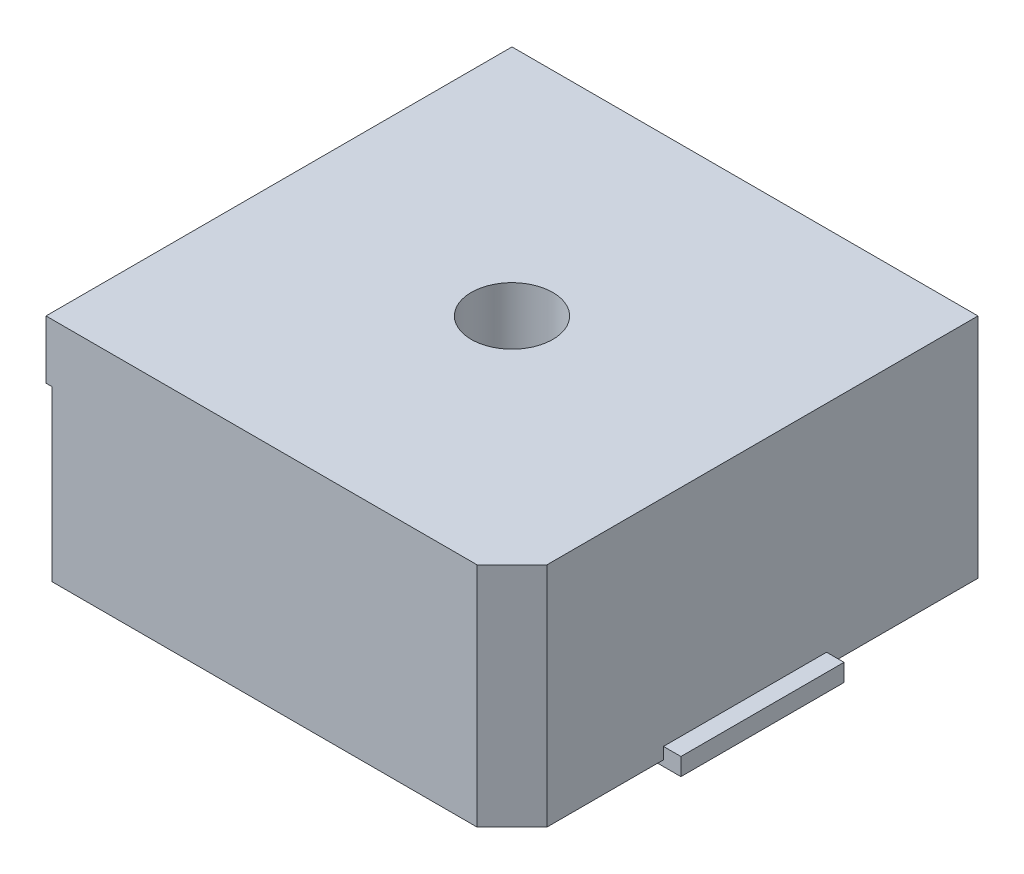
ISO-10303-21;
HEADER;
FILE_DESCRIPTION(('STEP AP214'),'2;1');
FILE_NAME('part.step','',(''),(''),'','','');
FILE_SCHEMA(('AUTOMOTIVE_DESIGN { 1 0 10303 214 1 1 1 1 }'));
ENDSEC;
DATA;
#1=APPLICATION_CONTEXT('core data for automotive mechanical design processes');
#2=APPLICATION_PROTOCOL_DEFINITION('international standard','automotive_design',2000,#1);
#3=PRODUCT_CONTEXT('',#1,'mechanical');
#4=PRODUCT('Part','Part','',(#3));
#5=PRODUCT_RELATED_PRODUCT_CATEGORY('part','',(#4));
#6=PRODUCT_DEFINITION_FORMATION('','',#4);
#7=PRODUCT_DEFINITION_CONTEXT('part definition',#1,'design');
#8=PRODUCT_DEFINITION('design','',#6,#7);
#9=PRODUCT_DEFINITION_SHAPE('','',#8);
#10=(LENGTH_UNIT() NAMED_UNIT(*) SI_UNIT(.MILLI.,.METRE.));
#11=(NAMED_UNIT(*) PLANE_ANGLE_UNIT() SI_UNIT($,.RADIAN.));
#12=(NAMED_UNIT(*) SI_UNIT($,.STERADIAN.) SOLID_ANGLE_UNIT());
#13=UNCERTAINTY_MEASURE_WITH_UNIT(LENGTH_MEASURE(1.E-05),#10,'distance_accuracy_value','');
#14=(GEOMETRIC_REPRESENTATION_CONTEXT(3) GLOBAL_UNCERTAINTY_ASSIGNED_CONTEXT((#13)) GLOBAL_UNIT_ASSIGNED_CONTEXT((#10,
#11,#12)) REPRESENTATION_CONTEXT('',''));
#15=CARTESIAN_POINT('',(0.,0.,0.));
#16=DIRECTION('',(0.,0.,1.));
#17=DIRECTION('',(1.,0.,0.));
#18=AXIS2_PLACEMENT_3D('',#15,#16,#17);
#19=CARTESIAN_POINT('',(-2.,2.,-2.));
#20=DIRECTION('',(1.,0.,0.));
#21=DIRECTION('',(0.,0.,-1.));
#22=AXIS2_PLACEMENT_3D('',#19,#20,#21);
#23=PLANE('',#22);
#24=DIRECTION('',(0.,-1.,0.));
#25=VECTOR('',#24,1.);
#26=CARTESIAN_POINT('',(-2.,2.,-2.));
#27=LINE('',#26,#25);
#28=CARTESIAN_POINT('',(-2.,2.,-2.));
#29=VERTEX_POINT('',#28);
#30=CARTESIAN_POINT('',(-2.,1.5,-2.));
#31=VERTEX_POINT('',#30);
#32=EDGE_CURVE('E439',#29,#31,#27,.T.);
#33=ORIENTED_EDGE('',*,*,#32,.T.);
#34=DIRECTION('',(0.,0.,-1.));
#35=VECTOR('',#34,1.);
#36=CARTESIAN_POINT('',(-2.,1.5,-2.));
#37=LINE('',#36,#35);
#38=CARTESIAN_POINT('',(-2.,1.5,-1.875));
#39=VERTEX_POINT('',#38);
#40=EDGE_CURVE('E485',#39,#31,#37,.T.);
#41=ORIENTED_EDGE('',*,*,#40,.F.);
#42=DIRECTION('',(0.,-1.,0.));
#43=VECTOR('',#42,1.);
#44=CARTESIAN_POINT('',(-2.,1.5,-1.875));
#45=LINE('',#44,#43);
#46=CARTESIAN_POINT('',(-2.,1.9,-1.875));
#47=VERTEX_POINT('',#46);
#48=EDGE_CURVE('E481',#47,#39,#45,.T.);
#49=ORIENTED_EDGE('',*,*,#48,.F.);
#50=DIRECTION('',(0.,0.,-1.));
#51=VECTOR('',#50,1.);
#52=CARTESIAN_POINT('',(-2.,1.9,1.875));
#53=LINE('',#52,#51);
#54=CARTESIAN_POINT('',(-2.,1.9,1.875));
#55=VERTEX_POINT('',#54);
#56=EDGE_CURVE('E472',#55,#47,#53,.T.);
#57=ORIENTED_EDGE('',*,*,#56,.F.);
#58=DIRECTION('',(0.,1.,0.));
#59=VECTOR('',#58,1.);
#60=CARTESIAN_POINT('',(-2.,1.9,1.875));
#61=LINE('',#60,#59);
#62=CARTESIAN_POINT('',(-2.,1.5,1.875));
#63=VERTEX_POINT('',#62);
#64=EDGE_CURVE('E464',#63,#55,#61,.T.);
#65=ORIENTED_EDGE('',*,*,#64,.F.);
#66=DIRECTION('',(0.,0.,-1.));
#67=VECTOR('',#66,1.);
#68=CARTESIAN_POINT('',(-2.,1.5,1.875));
#69=LINE('',#68,#67);
#70=CARTESIAN_POINT('',(-2.,1.5,2.));
#71=VERTEX_POINT('',#70);
#72=EDGE_CURVE('E461',#71,#63,#69,.T.);
#73=ORIENTED_EDGE('',*,*,#72,.F.);
#74=DIRECTION('',(0.,-1.,0.));
#75=VECTOR('',#74,1.);
#76=CARTESIAN_POINT('',(-2.,2.,2.));
#77=LINE('',#76,#75);
#78=CARTESIAN_POINT('',(-2.,2.,2.));
#79=VERTEX_POINT('',#78);
#80=EDGE_CURVE('E52',#79,#71,#77,.T.);
#81=ORIENTED_EDGE('',*,*,#80,.F.);
#82=DIRECTION('',(0.,0.,1.));
#83=VECTOR('',#82,1.);
#84=CARTESIAN_POINT('',(-2.,2.,-2.));
#85=LINE('',#84,#83);
#86=EDGE_CURVE('E425',#29,#79,#85,.T.);
#87=ORIENTED_EDGE('',*,*,#86,.F.);
#88=EDGE_LOOP('',(#33,#41,#49,#57,#65,#73,#81,#87));
#89=FACE_BOUND('',#88,.T.);
#90=ADVANCED_FACE('F42',(#89),#23,.F.);
#91=DIRECTION('',(0.,0.,-1.));
#92=VECTOR('',#91,1.);
#93=CARTESIAN_POINT('',(-2.,0.0499999999999997,2.));
#94=LINE('',#93,#92);
#95=CARTESIAN_POINT('',(-2.,0.0499999999999997,0.750000000000001));
#96=VERTEX_POINT('',#95);
#97=CARTESIAN_POINT('',(-2.,0.0499999999999997,0.7));
#98=VERTEX_POINT('',#97);
#99=EDGE_CURVE('E309',#96,#98,#94,.T.);
#100=ORIENTED_EDGE('',*,*,#99,.F.);
#101=DIRECTION('',(0.,-1.,0.));
#102=VECTOR('',#101,1.);
#103=CARTESIAN_POINT('',(-2.,1.7,0.750000000000001));
#104=LINE('',#103,#102);
#105=CARTESIAN_POINT('',(-2.,1.7,0.750000000000001));
#106=VERTEX_POINT('',#105);
#107=EDGE_CURVE('E467',#106,#96,#104,.T.);
#108=ORIENTED_EDGE('',*,*,#107,.F.);
#109=DIRECTION('',(0.,0.,1.));
#110=VECTOR('',#109,1.);
#111=CARTESIAN_POINT('',(-2.,1.7,-0.75));
#112=LINE('',#111,#110);
#113=CARTESIAN_POINT('',(-2.,1.7,-0.75));
#114=VERTEX_POINT('',#113);
#115=EDGE_CURVE('E474',#114,#106,#112,.T.);
#116=ORIENTED_EDGE('',*,*,#115,.F.);
#117=DIRECTION('',(0.,1.,0.));
#118=VECTOR('',#117,1.);
#119=CARTESIAN_POINT('',(-2.,0.0499999999999997,-0.75));
#120=LINE('',#119,#118);
#121=CARTESIAN_POINT('',(-2.,0.0499999999999997,-0.75));
#122=VERTEX_POINT('',#121);
#123=EDGE_CURVE('E521',#122,#114,#120,.T.);
#124=ORIENTED_EDGE('',*,*,#123,.F.);
#125=DIRECTION('',(0.,0.,-1.));
#126=VECTOR('',#125,1.);
#127=CARTESIAN_POINT('',(-2.,0.0499999999999997,-0.7));
#128=LINE('',#127,#126);
#129=CARTESIAN_POINT('',(-2.,0.0499999999999997,-0.7));
#130=VERTEX_POINT('',#129);
#131=EDGE_CURVE('E249',#130,#122,#128,.T.);
#132=ORIENTED_EDGE('',*,*,#131,.F.);
#133=DIRECTION('',(0.,-1.,0.));
#134=VECTOR('',#133,1.);
#135=CARTESIAN_POINT('',(-2.,2.,-0.7));
#136=LINE('',#135,#134);
#137=CARTESIAN_POINT('',(-2.,0.15,-0.7));
#138=VERTEX_POINT('',#137);
#139=EDGE_CURVE('E401',#138,#130,#136,.T.);
#140=ORIENTED_EDGE('',*,*,#139,.F.);
#141=DIRECTION('',(0.,0.,-1.));
#142=VECTOR('',#141,1.);
#143=CARTESIAN_POINT('',(-2.,0.15,-2.));
#144=LINE('',#143,#142);
#145=CARTESIAN_POINT('',(-2.,0.15,0.7));
#146=VERTEX_POINT('',#145);
#147=EDGE_CURVE('E411',#146,#138,#144,.T.);
#148=ORIENTED_EDGE('',*,*,#147,.F.);
#149=DIRECTION('',(0.,1.,0.));
#150=VECTOR('',#149,1.);
#151=CARTESIAN_POINT('',(-2.,2.,0.7));
#152=LINE('',#151,#150);
#153=EDGE_CURVE('E67',#98,#146,#152,.T.);
#154=ORIENTED_EDGE('',*,*,#153,.F.);
#155=EDGE_LOOP('',(#100,#108,#116,#124,#132,#140,#148,#154));
#156=FACE_BOUND('',#155,.T.);
#157=ADVANCED_FACE('F44',(#156),#23,.F.);
#158=CARTESIAN_POINT('',(2.,2.,-2.));
#159=DIRECTION('',(-1.,0.,0.));
#160=DIRECTION('',(0.,0.,1.));
#161=AXIS2_PLACEMENT_3D('',#158,#159,#160);
#162=PLANE('',#161);
#163=DIRECTION('',(0.,0.,1.));
#164=VECTOR('',#163,1.);
#165=CARTESIAN_POINT('',(2.,0.0499999999999997,-2.));
#166=LINE('',#165,#164);
#167=CARTESIAN_POINT('',(2.,0.0499999999999997,-2.));
#168=VERTEX_POINT('',#167);
#169=CARTESIAN_POINT('',(2.00000000000002,0.0499999999999997,-0.7));
#170=VERTEX_POINT('',#169);
#171=EDGE_CURVE('E283',#168,#170,#166,.T.);
#172=ORIENTED_EDGE('',*,*,#171,.F.);
#173=DIRECTION('',(0.,-1.,0.));
#174=VECTOR('',#173,1.);
#175=CARTESIAN_POINT('',(2.,2.,-2.));
#176=LINE('',#175,#174);
#177=CARTESIAN_POINT('',(2.,2.,-2.));
#178=VERTEX_POINT('',#177);
#179=EDGE_CURVE('E443',#178,#168,#176,.T.);
#180=ORIENTED_EDGE('',*,*,#179,.F.);
#181=DIRECTION('',(0.,0.,-1.));
#182=VECTOR('',#181,1.);
#183=CARTESIAN_POINT('',(2.,2.,-2.));
#184=LINE('',#183,#182);
#185=CARTESIAN_POINT('',(2.,2.,1.7));
#186=VERTEX_POINT('',#185);
#187=EDGE_CURVE('E433',#186,#178,#184,.T.);
#188=ORIENTED_EDGE('',*,*,#187,.F.);
#189=DIRECTION('',(0.,1.,0.));
#190=VECTOR('',#189,1.);
#191=CARTESIAN_POINT('',(2.,-0.42426406871194,1.7));
#192=LINE('',#191,#190);
#193=CARTESIAN_POINT('',(2.,0.0499999999999997,1.7));
#194=VERTEX_POINT('',#193);
#195=EDGE_CURVE('E422',#194,#186,#192,.T.);
#196=ORIENTED_EDGE('',*,*,#195,.F.);
#197=DIRECTION('',(0.,0.,1.));
#198=VECTOR('',#197,1.);
#199=CARTESIAN_POINT('',(2.00000000000002,0.0499999999999997,0.7));
#200=LINE('',#199,#198);
#201=CARTESIAN_POINT('',(2.00000000000002,0.0499999999999997,0.7));
#202=VERTEX_POINT('',#201);
#203=EDGE_CURVE('E299',#202,#194,#200,.T.);
#204=ORIENTED_EDGE('',*,*,#203,.F.);
#205=DIRECTION('',(0.,-1.,0.));
#206=VECTOR('',#205,1.);
#207=CARTESIAN_POINT('',(2.00000000000002,2.,0.7));
#208=LINE('',#207,#206);
#209=CARTESIAN_POINT('',(2.00000000000002,0.15,0.7));
#210=VERTEX_POINT('',#209);
#211=EDGE_CURVE('E405',#210,#202,#208,.T.);
#212=ORIENTED_EDGE('',*,*,#211,.F.);
#213=DIRECTION('',(0.,0.,1.));
#214=VECTOR('',#213,1.);
#215=CARTESIAN_POINT('',(2.,0.15,-2.));
#216=LINE('',#215,#214);
#217=CARTESIAN_POINT('',(2.00000000000002,0.15,-0.7));
#218=VERTEX_POINT('',#217);
#219=EDGE_CURVE('E11',#218,#210,#216,.T.);
#220=ORIENTED_EDGE('',*,*,#219,.F.);
#221=DIRECTION('',(0.,1.,0.));
#222=VECTOR('',#221,1.);
#223=CARTESIAN_POINT('',(2.00000000000002,2.,-0.7));
#224=LINE('',#223,#222);
#225=EDGE_CURVE('E398',#170,#218,#224,.T.);
#226=ORIENTED_EDGE('',*,*,#225,.F.);
#227=EDGE_LOOP('',(#172,#180,#188,#196,#204,#212,#220,#226));
#228=FACE_BOUND('',#227,.T.);
#229=ADVANCED_FACE('F567',(#228),#162,.F.);
#230=CARTESIAN_POINT('',(2.,2.,1.99999999999999));
#231=DIRECTION('',(0.,0.,-1.));
#232=DIRECTION('',(-1.,0.,0.));
#233=AXIS2_PLACEMENT_3D('',#230,#231,#232);
#234=PLANE('',#233);
#235=ORIENTED_EDGE('',*,*,#80,.T.);
#236=DIRECTION('',(-1.,0.,0.));
#237=VECTOR('',#236,1.);
#238=CARTESIAN_POINT('',(-1.95,1.5,1.99999999999999));
#239=LINE('',#238,#237);
#240=CARTESIAN_POINT('',(-1.95,1.5,1.99999999999999));
#241=VERTEX_POINT('',#240);
#242=EDGE_CURVE('E455',#241,#71,#239,.T.);
#243=ORIENTED_EDGE('',*,*,#242,.F.);
#244=DIRECTION('',(0.,1.,0.));
#245=VECTOR('',#244,1.);
#246=CARTESIAN_POINT('',(-1.95,0.0499999999999997,1.99999999999999));
#247=LINE('',#246,#245);
#248=CARTESIAN_POINT('',(-1.95,0.0499999999999997,1.99999999999999));
#249=VERTEX_POINT('',#248);
#250=EDGE_CURVE('E591',#249,#241,#247,.T.);
#251=ORIENTED_EDGE('',*,*,#250,.F.);
#252=DIRECTION('',(-1.,0.,0.));
#253=VECTOR('',#252,1.);
#254=CARTESIAN_POINT('',(1.7,0.0499999999999997,2.));
#255=LINE('',#254,#253);
#256=CARTESIAN_POINT('',(1.7,0.0499999999999997,2.));
#257=VERTEX_POINT('',#256);
#258=EDGE_CURVE('E305',#257,#249,#255,.T.);
#259=ORIENTED_EDGE('',*,*,#258,.F.);
#260=DIRECTION('',(0.,1.,0.));
#261=VECTOR('',#260,1.);
#262=CARTESIAN_POINT('',(1.7,-0.42426406871194,2.));
#263=LINE('',#262,#261);
#264=CARTESIAN_POINT('',(1.7,2.,2.));
#265=VERTEX_POINT('',#264);
#266=EDGE_CURVE('E419',#257,#265,#263,.T.);
#267=ORIENTED_EDGE('',*,*,#266,.T.);
#268=DIRECTION('',(1.,0.,0.));
#269=VECTOR('',#268,1.);
#270=CARTESIAN_POINT('',(2.,2.,1.99999999999999));
#271=LINE('',#270,#269);
#272=EDGE_CURVE('E429',#79,#265,#271,.T.);
#273=ORIENTED_EDGE('',*,*,#272,.F.);
#274=EDGE_LOOP('',(#235,#243,#251,#259,#267,#273));
#275=FACE_BOUND('',#274,.T.);
#276=ADVANCED_FACE('F453',(#275),#234,.F.);
#277=CARTESIAN_POINT('',(2.,2.,-2.));
#278=DIRECTION('',(0.,0.,1.));
#279=DIRECTION('',(1.,0.,0.));
#280=AXIS2_PLACEMENT_3D('',#277,#278,#279);
#281=PLANE('',#280);
#282=DIRECTION('',(0.,-1.,0.));
#283=VECTOR('',#282,1.);
#284=CARTESIAN_POINT('',(-1.95,1.5,-2.));
#285=LINE('',#284,#283);
#286=CARTESIAN_POINT('',(-1.95,1.5,-2.));
#287=VERTEX_POINT('',#286);
#288=CARTESIAN_POINT('',(-1.95,0.0499999999999997,-2.));
#289=VERTEX_POINT('',#288);
#290=EDGE_CURVE('E59',#287,#289,#285,.T.);
#291=ORIENTED_EDGE('',*,*,#290,.F.);
#292=DIRECTION('',(-1.,0.,0.));
#293=VECTOR('',#292,1.);
#294=CARTESIAN_POINT('',(-1.95,1.5,-2.));
#295=LINE('',#294,#293);
#296=EDGE_CURVE('E279',#287,#31,#295,.T.);
#297=ORIENTED_EDGE('',*,*,#296,.T.);
#298=ORIENTED_EDGE('',*,*,#32,.F.);
#299=DIRECTION('',(-1.,0.,0.));
#300=VECTOR('',#299,1.);
#301=CARTESIAN_POINT('',(2.,2.,-2.));
#302=LINE('',#301,#300);
#303=EDGE_CURVE('E436',#178,#29,#302,.T.);
#304=ORIENTED_EDGE('',*,*,#303,.F.);
#305=ORIENTED_EDGE('',*,*,#179,.T.);
#306=DIRECTION('',(1.,0.,0.));
#307=VECTOR('',#306,1.);
#308=CARTESIAN_POINT('',(-2.,0.0499999999999997,-2.));
#309=LINE('',#308,#307);
#310=EDGE_CURVE('E280',#289,#168,#309,.T.);
#311=ORIENTED_EDGE('',*,*,#310,.F.);
#312=EDGE_LOOP('',(#291,#297,#298,#304,#305,#311));
#313=FACE_BOUND('',#312,.T.);
#314=ADVANCED_FACE('F546',(#313),#281,.F.);
#315=CARTESIAN_POINT('',(0.,0.,0.));
#316=DIRECTION('',(0.,-1.,0.));
#317=DIRECTION('',(0.,0.,-1.));
#318=AXIS2_PLACEMENT_3D('',#315,#316,#317);
#319=PLANE('',#318);
#320=DIRECTION('',(1.,0.,0.));
#321=VECTOR('',#320,1.);
#322=CARTESIAN_POINT('',(-2.15,0.,-0.7));
#323=LINE('',#322,#321);
#324=CARTESIAN_POINT('',(-2.15,0.,-0.7));
#325=VERTEX_POINT('',#324);
#326=CARTESIAN_POINT('',(-1.65,0.,-0.7));
#327=VERTEX_POINT('',#326);
#328=EDGE_CURVE('E381',#325,#327,#323,.T.);
#329=ORIENTED_EDGE('',*,*,#328,.T.);
#330=DIRECTION('',(0.,0.,-1.));
#331=VECTOR('',#330,1.);
#332=CARTESIAN_POINT('',(-1.65,0.,-0.7));
#333=LINE('',#332,#331);
#334=CARTESIAN_POINT('',(-1.65,0.,0.7));
#335=VERTEX_POINT('',#334);
#336=EDGE_CURVE('E284',#335,#327,#333,.T.);
#337=ORIENTED_EDGE('',*,*,#336,.F.);
#338=DIRECTION('',(1.,0.,0.));
#339=VECTOR('',#338,1.);
#340=CARTESIAN_POINT('',(-2.15,0.,0.7));
#341=LINE('',#340,#339);
#342=CARTESIAN_POINT('',(-2.15,0.,0.7));
#343=VERTEX_POINT('',#342);
#344=EDGE_CURVE('E395',#343,#335,#341,.T.);
#345=ORIENTED_EDGE('',*,*,#344,.F.);
#346=DIRECTION('',(0.,0.,1.));
#347=VECTOR('',#346,1.);
#348=CARTESIAN_POINT('',(-2.15,0.,0.7));
#349=LINE('',#348,#347);
#350=EDGE_CURVE('E352',#325,#343,#349,.T.);
#351=ORIENTED_EDGE('',*,*,#350,.F.);
#352=EDGE_LOOP('',(#329,#337,#345,#351));
#353=FACE_BOUND('',#352,.T.);
#354=ADVANCED_FACE('F543',(#353),#319,.T.);
#355=CARTESIAN_POINT('',(2.,-0.42426406871194,1.7));
#356=DIRECTION('',(-0.707106781186552,0.,-0.707106781186543));
#357=DIRECTION('',(-0.707106781186543,0.,0.707106781186552));
#358=AXIS2_PLACEMENT_3D('',#355,#356,#357);
#359=PLANE('',#358);
#360=DIRECTION('',(-0.707106781186544,0.,0.707106781186551));
#361=VECTOR('',#360,1.);
#362=CARTESIAN_POINT('',(2.,0.0499999999999997,1.7));
#363=LINE('',#362,#361);
#364=EDGE_CURVE('E302',#194,#257,#363,.T.);
#365=ORIENTED_EDGE('',*,*,#364,.F.);
#366=ORIENTED_EDGE('',*,*,#195,.T.);
#367=DIRECTION('',(-0.707106781186544,0.,0.707106781186552));
#368=VECTOR('',#367,1.);
#369=CARTESIAN_POINT('',(2.,2.,1.7));
#370=LINE('',#369,#368);
#371=EDGE_CURVE('E415',#186,#265,#370,.T.);
#372=ORIENTED_EDGE('',*,*,#371,.T.);
#373=ORIENTED_EDGE('',*,*,#266,.F.);
#374=EDGE_LOOP('',(#365,#366,#372,#373));
#375=FACE_BOUND('',#374,.T.);
#376=ADVANCED_FACE('F545',(#375),#359,.F.);
#377=CARTESIAN_POINT('',(0.,2.98994949366117,0.));
#378=DIRECTION('',(0.,-1.,0.));
#379=DIRECTION('',(0.,0.,-1.));
#380=AXIS2_PLACEMENT_3D('',#377,#378,#379);
#381=CYLINDRICAL_SURFACE('',#380,0.35);
#382=CARTESIAN_POINT('',(0.,2.,0.));
#383=DIRECTION('',(0.,-1.,0.));
#384=DIRECTION('',(0.,0.,-1.));
#385=AXIS2_PLACEMENT_3D('',#382,#383,#384);
#386=CIRCLE('',#385,0.35);
#387=CARTESIAN_POINT('',(0.,2.,-0.35));
#388=VERTEX_POINT('',#387);
#389=EDGE_CURVE('E347',#388,#388,#386,.F.);
#390=ORIENTED_EDGE('',*,*,#389,.T.);
#391=EDGE_LOOP('',(#390));
#392=FACE_BOUND('',#391,.T.);
#393=CARTESIAN_POINT('',(0.,0.0500000000000006,0.));
#394=DIRECTION('',(0.,-1.,0.));
#395=DIRECTION('',(0.,0.,-1.));
#396=AXIS2_PLACEMENT_3D('',#393,#394,#395);
#397=CIRCLE('',#396,0.35);
#398=CARTESIAN_POINT('',(0.,0.0500000000000006,-0.35));
#399=VERTEX_POINT('',#398);
#400=EDGE_CURVE('E46',#399,#399,#397,.F.);
#401=ORIENTED_EDGE('',*,*,#400,.F.);
#402=EDGE_LOOP('',(#401));
#403=FACE_BOUND('',#402,.T.);
#404=ADVANCED_FACE('F553',(#392,#403),#381,.F.);
#405=CARTESIAN_POINT('',(0.,2.,0.));
#406=DIRECTION('',(0.,-1.,0.));
#407=DIRECTION('',(0.,0.,-1.));
#408=AXIS2_PLACEMENT_3D('',#405,#406,#407);
#409=PLANE('',#408);
#410=ORIENTED_EDGE('',*,*,#389,.F.);
#411=EDGE_LOOP('',(#410));
#412=FACE_BOUND('',#411,.T.);
#413=ORIENTED_EDGE('',*,*,#272,.T.);
#414=ORIENTED_EDGE('',*,*,#371,.F.);
#415=ORIENTED_EDGE('',*,*,#187,.T.);
#416=ORIENTED_EDGE('',*,*,#303,.T.);
#417=ORIENTED_EDGE('',*,*,#86,.T.);
#418=EDGE_LOOP('',(#413,#414,#415,#416,#417));
#419=FACE_BOUND('',#418,.T.);
#420=ADVANCED_FACE('F561',(#412,#419),#409,.F.);
#421=CARTESIAN_POINT('',(1.65000000000002,0.,0.7));
#422=VERTEX_POINT('',#421);
#423=CARTESIAN_POINT('',(2.15000000000002,0.,0.7));
#424=VERTEX_POINT('',#423);
#425=EDGE_CURVE('E394',#422,#424,#341,.T.);
#426=ORIENTED_EDGE('',*,*,#425,.F.);
#427=DIRECTION('',(0.,0.,1.));
#428=VECTOR('',#427,1.);
#429=CARTESIAN_POINT('',(1.65000000000002,0.,0.7));
#430=LINE('',#429,#428);
#431=CARTESIAN_POINT('',(1.65000000000002,0.,-0.7));
#432=VERTEX_POINT('',#431);
#433=EDGE_CURVE('E266',#432,#422,#430,.T.);
#434=ORIENTED_EDGE('',*,*,#433,.F.);
#435=CARTESIAN_POINT('',(2.15000000000002,0.,-0.7));
#436=VERTEX_POINT('',#435);
#437=EDGE_CURVE('E366',#432,#436,#323,.T.);
#438=ORIENTED_EDGE('',*,*,#437,.T.);
#439=DIRECTION('',(0.,0.,1.));
#440=VECTOR('',#439,1.);
#441=CARTESIAN_POINT('',(2.15000000000002,0.,0.7));
#442=LINE('',#441,#440);
#443=EDGE_CURVE('E351',#436,#424,#442,.T.);
#444=ORIENTED_EDGE('',*,*,#443,.T.);
#445=EDGE_LOOP('',(#426,#434,#438,#444));
#446=FACE_BOUND('',#445,.T.);
#447=ADVANCED_FACE('F548',(#446),#319,.T.);
#448=CARTESIAN_POINT('',(2.15000000000002,0.,0.));
#449=DIRECTION('',(1.,0.,0.));
#450=DIRECTION('',(0.,0.,-1.));
#451=AXIS2_PLACEMENT_3D('',#448,#449,#450);
#452=PLANE('',#451);
#453=ORIENTED_EDGE('',*,*,#443,.F.);
#454=DIRECTION('',(0.,-1.,0.));
#455=VECTOR('',#454,1.);
#456=CARTESIAN_POINT('',(2.15000000000002,0.,-0.7));
#457=LINE('',#456,#455);
#458=CARTESIAN_POINT('',(2.15000000000002,0.15,-0.7));
#459=VERTEX_POINT('',#458);
#460=EDGE_CURVE('E357',#459,#436,#457,.T.);
#461=ORIENTED_EDGE('',*,*,#460,.F.);
#462=DIRECTION('',(0.,0.,-1.));
#463=VECTOR('',#462,1.);
#464=CARTESIAN_POINT('',(2.15000000000002,0.15,-0.7));
#465=LINE('',#464,#463);
#466=CARTESIAN_POINT('',(2.15000000000002,0.15,0.7));
#467=VERTEX_POINT('',#466);
#468=EDGE_CURVE('E374',#467,#459,#465,.T.);
#469=ORIENTED_EDGE('',*,*,#468,.F.);
#470=DIRECTION('',(0.,1.,0.));
#471=VECTOR('',#470,1.);
#472=CARTESIAN_POINT('',(2.15000000000002,0.15,0.7));
#473=LINE('',#472,#471);
#474=EDGE_CURVE('E370',#424,#467,#473,.T.);
#475=ORIENTED_EDGE('',*,*,#474,.F.);
#476=EDGE_LOOP('',(#453,#461,#469,#475));
#477=FACE_BOUND('',#476,.T.);
#478=ADVANCED_FACE('F560',(#477),#452,.T.);
#479=CARTESIAN_POINT('',(-2.15,0.,-0.7));
#480=DIRECTION('',(0.,0.,1.));
#481=DIRECTION('',(1.,0.,0.));
#482=AXIS2_PLACEMENT_3D('',#479,#480,#481);
#483=PLANE('',#482);
#484=ORIENTED_EDGE('',*,*,#437,.F.);
#485=DIRECTION('',(0.,-1.,0.));
#486=VECTOR('',#485,1.);
#487=CARTESIAN_POINT('',(1.65000000000002,0.0499999999999997,-0.7));
#488=LINE('',#487,#486);
#489=CARTESIAN_POINT('',(1.65000000000002,0.0499999999999997,-0.7));
#490=VERTEX_POINT('',#489);
#491=EDGE_CURVE('E325',#490,#432,#488,.T.);
#492=ORIENTED_EDGE('',*,*,#491,.F.);
#493=DIRECTION('',(-1.,0.,0.));
#494=VECTOR('',#493,1.);
#495=CARTESIAN_POINT('',(1.65000000000002,0.0499999999999997,-0.7));
#496=LINE('',#495,#494);
#497=EDGE_CURVE('E288',#170,#490,#496,.T.);
#498=ORIENTED_EDGE('',*,*,#497,.F.);
#499=ORIENTED_EDGE('',*,*,#225,.T.);
#500=DIRECTION('',(1.,0.,0.));
#501=VECTOR('',#500,1.);
#502=CARTESIAN_POINT('',(-2.15,0.15,-0.7));
#503=LINE('',#502,#501);
#504=EDGE_CURVE('E384',#218,#459,#503,.T.);
#505=ORIENTED_EDGE('',*,*,#504,.T.);
#506=ORIENTED_EDGE('',*,*,#460,.T.);
#507=EDGE_LOOP('',(#484,#492,#498,#499,#505,#506));
#508=FACE_BOUND('',#507,.T.);
#509=ADVANCED_FACE('F680',(#508),#483,.F.);
#510=CARTESIAN_POINT('',(-2.15,0.15,-0.7));
#511=DIRECTION('',(0.,-1.,0.));
#512=DIRECTION('',(0.,0.,-1.));
#513=AXIS2_PLACEMENT_3D('',#510,#511,#512);
#514=PLANE('',#513);
#515=ORIENTED_EDGE('',*,*,#504,.F.);
#516=ORIENTED_EDGE('',*,*,#219,.T.);
#517=DIRECTION('',(1.,0.,0.));
#518=VECTOR('',#517,1.);
#519=CARTESIAN_POINT('',(-2.15,0.15,0.7));
#520=LINE('',#519,#518);
#521=EDGE_CURVE('E389',#210,#467,#520,.T.);
#522=ORIENTED_EDGE('',*,*,#521,.T.);
#523=ORIENTED_EDGE('',*,*,#468,.T.);
#524=EDGE_LOOP('',(#515,#516,#522,#523));
#525=FACE_BOUND('',#524,.T.);
#526=ADVANCED_FACE('F687',(#525),#514,.F.);
#527=CARTESIAN_POINT('',(-2.15,0.15,0.7));
#528=DIRECTION('',(0.,0.,-1.));
#529=DIRECTION('',(-1.,0.,0.));
#530=AXIS2_PLACEMENT_3D('',#527,#528,#529);
#531=PLANE('',#530);
#532=ORIENTED_EDGE('',*,*,#521,.F.);
#533=ORIENTED_EDGE('',*,*,#211,.T.);
#534=DIRECTION('',(1.,0.,0.));
#535=VECTOR('',#534,1.);
#536=CARTESIAN_POINT('',(2.00000000000002,0.0499999999999997,0.7));
#537=LINE('',#536,#535);
#538=CARTESIAN_POINT('',(1.65000000000002,0.0499999999999997,0.7));
#539=VERTEX_POINT('',#538);
#540=EDGE_CURVE('E296',#539,#202,#537,.T.);
#541=ORIENTED_EDGE('',*,*,#540,.F.);
#542=DIRECTION('',(0.,-1.,0.));
#543=VECTOR('',#542,1.);
#544=CARTESIAN_POINT('',(1.65000000000002,0.0499999999999997,0.7));
#545=LINE('',#544,#543);
#546=EDGE_CURVE('E340',#539,#422,#545,.T.);
#547=ORIENTED_EDGE('',*,*,#546,.T.);
#548=ORIENTED_EDGE('',*,*,#425,.T.);
#549=ORIENTED_EDGE('',*,*,#474,.T.);
#550=EDGE_LOOP('',(#532,#533,#541,#547,#548,#549));
#551=FACE_BOUND('',#550,.T.);
#552=ADVANCED_FACE('F686',(#551),#531,.F.);
#553=CARTESIAN_POINT('',(-2.15,0.15,0.7));
#554=VERTEX_POINT('',#553);
#555=EDGE_CURVE('E390',#554,#146,#520,.T.);
#556=ORIENTED_EDGE('',*,*,#555,.T.);
#557=ORIENTED_EDGE('',*,*,#147,.T.);
#558=CARTESIAN_POINT('',(-2.15,0.15,-0.7));
#559=VERTEX_POINT('',#558);
#560=EDGE_CURVE('E385',#559,#138,#503,.T.);
#561=ORIENTED_EDGE('',*,*,#560,.F.);
#562=DIRECTION('',(0.,0.,-1.));
#563=VECTOR('',#562,1.);
#564=CARTESIAN_POINT('',(-2.15,0.15,-0.7));
#565=LINE('',#564,#563);
#566=EDGE_CURVE('E360',#554,#559,#565,.T.);
#567=ORIENTED_EDGE('',*,*,#566,.F.);
#568=EDGE_LOOP('',(#556,#557,#561,#567));
#569=FACE_BOUND('',#568,.T.);
#570=ADVANCED_FACE('F538',(#569),#514,.F.);
#571=ORIENTED_EDGE('',*,*,#344,.T.);
#572=DIRECTION('',(0.,-1.,0.));
#573=VECTOR('',#572,1.);
#574=CARTESIAN_POINT('',(-1.65,0.0499999999999997,0.7));
#575=LINE('',#574,#573);
#576=CARTESIAN_POINT('',(-1.65,0.0499999999999997,0.7));
#577=VERTEX_POINT('',#576);
#578=EDGE_CURVE('E336',#577,#335,#575,.T.);
#579=ORIENTED_EDGE('',*,*,#578,.F.);
#580=DIRECTION('',(1.,0.,0.));
#581=VECTOR('',#580,1.);
#582=CARTESIAN_POINT('',(-1.65,0.0499999999999997,0.7));
#583=LINE('',#582,#581);
#584=EDGE_CURVE('E312',#98,#577,#583,.T.);
#585=ORIENTED_EDGE('',*,*,#584,.F.);
#586=ORIENTED_EDGE('',*,*,#153,.T.);
#587=ORIENTED_EDGE('',*,*,#555,.F.);
#588=DIRECTION('',(0.,1.,0.));
#589=VECTOR('',#588,1.);
#590=CARTESIAN_POINT('',(-2.15,0.15,0.7));
#591=LINE('',#590,#589);
#592=EDGE_CURVE('E356',#343,#554,#591,.T.);
#593=ORIENTED_EDGE('',*,*,#592,.F.);
#594=EDGE_LOOP('',(#571,#579,#585,#586,#587,#593));
#595=FACE_BOUND('',#594,.T.);
#596=ADVANCED_FACE('F524',(#595),#531,.F.);
#597=ORIENTED_EDGE('',*,*,#560,.T.);
#598=ORIENTED_EDGE('',*,*,#139,.T.);
#599=DIRECTION('',(-1.,0.,0.));
#600=VECTOR('',#599,1.);
#601=CARTESIAN_POINT('',(-2.,0.0499999999999997,-0.7));
#602=LINE('',#601,#600);
#603=CARTESIAN_POINT('',(-1.65,0.0499999999999997,-0.7));
#604=VERTEX_POINT('',#603);
#605=EDGE_CURVE('E320',#604,#130,#602,.T.);
#606=ORIENTED_EDGE('',*,*,#605,.F.);
#607=DIRECTION('',(0.,-1.,0.));
#608=VECTOR('',#607,1.);
#609=CARTESIAN_POINT('',(-1.65,0.0499999999999997,-0.7));
#610=LINE('',#609,#608);
#611=EDGE_CURVE('E332',#604,#327,#610,.T.);
#612=ORIENTED_EDGE('',*,*,#611,.T.);
#613=ORIENTED_EDGE('',*,*,#328,.F.);
#614=DIRECTION('',(0.,-1.,0.));
#615=VECTOR('',#614,1.);
#616=CARTESIAN_POINT('',(-2.15,0.,-0.7));
#617=LINE('',#616,#615);
#618=EDGE_CURVE('E363',#559,#325,#617,.T.);
#619=ORIENTED_EDGE('',*,*,#618,.F.);
#620=EDGE_LOOP('',(#597,#598,#606,#612,#613,#619));
#621=FACE_BOUND('',#620,.T.);
#622=ADVANCED_FACE('F532',(#621),#483,.F.);
#623=CARTESIAN_POINT('',(-2.15,0.,0.));
#624=DIRECTION('',(1.,0.,0.));
#625=DIRECTION('',(0.,0.,-1.));
#626=AXIS2_PLACEMENT_3D('',#623,#624,#625);
#627=PLANE('',#626);
#628=ORIENTED_EDGE('',*,*,#350,.T.);
#629=ORIENTED_EDGE('',*,*,#592,.T.);
#630=ORIENTED_EDGE('',*,*,#566,.T.);
#631=ORIENTED_EDGE('',*,*,#618,.T.);
#632=EDGE_LOOP('',(#628,#629,#630,#631));
#633=FACE_BOUND('',#632,.T.);
#634=ADVANCED_FACE('F541',(#633),#627,.F.);
#635=CARTESIAN_POINT('',(0.,0.0499999999999997,0.));
#636=DIRECTION('',(0.,-1.,0.));
#637=DIRECTION('',(0.,0.,-1.));
#638=AXIS2_PLACEMENT_3D('',#635,#636,#637);
#639=PLANE('',#638);
#640=DIRECTION('',(-1.,0.,0.));
#641=VECTOR('',#640,1.);
#642=CARTESIAN_POINT('',(-1.95,0.0499999999999997,0.750000000000001));
#643=LINE('',#642,#641);
#644=CARTESIAN_POINT('',(-1.95,0.0499999999999997,0.750000000000001));
#645=VERTEX_POINT('',#644);
#646=EDGE_CURVE('E505',#645,#96,#643,.T.);
#647=ORIENTED_EDGE('',*,*,#646,.T.);
#648=ORIENTED_EDGE('',*,*,#99,.T.);
#649=ORIENTED_EDGE('',*,*,#584,.T.);
#650=DIRECTION('',(0.,0.,-1.));
#651=VECTOR('',#650,1.);
#652=CARTESIAN_POINT('',(-1.65,0.0499999999999997,-0.7));
#653=LINE('',#652,#651);
#654=EDGE_CURVE('E316',#577,#604,#653,.T.);
#655=ORIENTED_EDGE('',*,*,#654,.T.);
#656=ORIENTED_EDGE('',*,*,#605,.T.);
#657=ORIENTED_EDGE('',*,*,#131,.T.);
#658=DIRECTION('',(-1.,0.,0.));
#659=VECTOR('',#658,1.);
#660=CARTESIAN_POINT('',(-1.95,0.0499999999999997,-0.75));
#661=LINE('',#660,#659);
#662=CARTESIAN_POINT('',(-1.95,0.0499999999999997,-0.75));
#663=VERTEX_POINT('',#662);
#664=EDGE_CURVE('E230',#663,#122,#661,.T.);
#665=ORIENTED_EDGE('',*,*,#664,.F.);
#666=DIRECTION('',(0.,0.,1.));
#667=VECTOR('',#666,1.);
#668=CARTESIAN_POINT('',(-1.95,0.0499999999999997,-2.));
#669=LINE('',#668,#667);
#670=EDGE_CURVE('E237',#289,#663,#669,.T.);
#671=ORIENTED_EDGE('',*,*,#670,.F.);
#672=ORIENTED_EDGE('',*,*,#310,.T.);
#673=ORIENTED_EDGE('',*,*,#171,.T.);
#674=ORIENTED_EDGE('',*,*,#497,.T.);
#675=DIRECTION('',(0.,0.,1.));
#676=VECTOR('',#675,1.);
#677=CARTESIAN_POINT('',(1.65000000000002,0.0499999999999997,0.7));
#678=LINE('',#677,#676);
#679=EDGE_CURVE('E292',#490,#539,#678,.T.);
#680=ORIENTED_EDGE('',*,*,#679,.T.);
#681=ORIENTED_EDGE('',*,*,#540,.T.);
#682=ORIENTED_EDGE('',*,*,#203,.T.);
#683=ORIENTED_EDGE('',*,*,#364,.T.);
#684=ORIENTED_EDGE('',*,*,#258,.T.);
#685=DIRECTION('',(0.,0.,1.));
#686=VECTOR('',#685,1.);
#687=CARTESIAN_POINT('',(-1.95,0.0499999999999997,0.750000000000001));
#688=LINE('',#687,#686);
#689=EDGE_CURVE('E595',#645,#249,#688,.T.);
#690=ORIENTED_EDGE('',*,*,#689,.F.);
#691=EDGE_LOOP('',(#647,#648,#649,#655,#656,#657,#665,#671,#672,#673,#674,#680,#681,#682,#683,
#684,#690));
#692=FACE_BOUND('',#691,.T.);
#693=CARTESIAN_POINT('',(-1.,0.0499999999999997,0.));
#694=DIRECTION('',(0.,-1.,0.));
#695=DIRECTION('',(0.,0.,-1.));
#696=AXIS2_PLACEMENT_3D('',#693,#694,#695);
#697=CIRCLE('',#696,0.1);
#698=CARTESIAN_POINT('',(-1.,0.0499999999999997,-0.1));
#699=VERTEX_POINT('',#698);
#700=EDGE_CURVE('E267',#699,#699,#697,.T.);
#701=ORIENTED_EDGE('',*,*,#700,.F.);
#702=EDGE_LOOP('',(#701));
#703=FACE_BOUND('',#702,.T.);
#704=CARTESIAN_POINT('',(1.00000000000002,0.0499999999999997,0.));
#705=DIRECTION('',(0.,-1.,0.));
#706=DIRECTION('',(0.,0.,-1.));
#707=AXIS2_PLACEMENT_3D('',#704,#705,#706);
#708=CIRCLE('',#707,0.1);
#709=CARTESIAN_POINT('',(1.00000000000002,0.0499999999999997,-0.1));
#710=VERTEX_POINT('',#709);
#711=EDGE_CURVE('E275',#710,#710,#708,.T.);
#712=ORIENTED_EDGE('',*,*,#711,.F.);
#713=EDGE_LOOP('',(#712));
#714=FACE_BOUND('',#713,.T.);
#715=ORIENTED_EDGE('',*,*,#400,.T.);
#716=EDGE_LOOP('',(#715));
#717=FACE_BOUND('',#716,.T.);
#718=ADVANCED_FACE('F246',(#692,#703,#714,#717),#639,.T.);
#719=CARTESIAN_POINT('',(-1.65,0.0499999999999997,-0.7));
#720=DIRECTION('',(-1.,0.,0.));
#721=DIRECTION('',(0.,0.,1.));
#722=AXIS2_PLACEMENT_3D('',#719,#720,#721);
#723=PLANE('',#722);
#724=ORIENTED_EDGE('',*,*,#336,.T.);
#725=ORIENTED_EDGE('',*,*,#611,.F.);
#726=ORIENTED_EDGE('',*,*,#654,.F.);
#727=ORIENTED_EDGE('',*,*,#578,.T.);
#728=EDGE_LOOP('',(#724,#725,#726,#727));
#729=FACE_BOUND('',#728,.T.);
#730=ADVANCED_FACE('F529',(#729),#723,.F.);
#731=CARTESIAN_POINT('',(1.65000000000002,0.0499999999999997,0.7));
#732=DIRECTION('',(1.,0.,0.));
#733=DIRECTION('',(0.,0.,-1.));
#734=AXIS2_PLACEMENT_3D('',#731,#732,#733);
#735=PLANE('',#734);
#736=ORIENTED_EDGE('',*,*,#433,.T.);
#737=ORIENTED_EDGE('',*,*,#546,.F.);
#738=ORIENTED_EDGE('',*,*,#679,.F.);
#739=ORIENTED_EDGE('',*,*,#491,.T.);
#740=EDGE_LOOP('',(#736,#737,#738,#739));
#741=FACE_BOUND('',#740,.T.);
#742=ADVANCED_FACE('F664',(#741),#735,.F.);
#743=CARTESIAN_POINT('',(1.00000000000002,1.55,0.));
#744=DIRECTION('',(0.,-1.,0.));
#745=DIRECTION('',(0.,0.,-1.));
#746=AXIS2_PLACEMENT_3D('',#743,#744,#745);
#747=CYLINDRICAL_SURFACE('',#746,0.1);
#748=CARTESIAN_POINT('',(1.00000000000002,1.55,0.));
#749=DIRECTION('',(0.,-1.,0.));
#750=DIRECTION('',(0.,0.,-1.));
#751=AXIS2_PLACEMENT_3D('',#748,#749,#750);
#752=CIRCLE('',#751,0.1);
#753=CARTESIAN_POINT('',(1.00000000000002,1.55,-0.1));
#754=VERTEX_POINT('',#753);
#755=EDGE_CURVE('E271',#754,#754,#752,.T.);
#756=ORIENTED_EDGE('',*,*,#755,.F.);
#757=EDGE_LOOP('',(#756));
#758=FACE_BOUND('',#757,.T.);
#759=ORIENTED_EDGE('',*,*,#711,.T.);
#760=EDGE_LOOP('',(#759));
#761=FACE_BOUND('',#760,.T.);
#762=ADVANCED_FACE('F660',(#758,#761),#747,.F.);
#763=CARTESIAN_POINT('',(1.00000000000002,1.55,0.));
#764=DIRECTION('',(0.,-1.,0.));
#765=DIRECTION('',(0.,0.,-1.));
#766=AXIS2_PLACEMENT_3D('',#763,#764,#765);
#767=PLANE('',#766);
#768=ORIENTED_EDGE('',*,*,#755,.T.);
#769=EDGE_LOOP('',(#768));
#770=FACE_BOUND('',#769,.T.);
#771=ADVANCED_FACE('F656',(#770),#767,.T.);
#772=CARTESIAN_POINT('',(-1.,1.55,0.));
#773=DIRECTION('',(0.,-1.,0.));
#774=DIRECTION('',(0.,0.,-1.));
#775=AXIS2_PLACEMENT_3D('',#772,#773,#774);
#776=CYLINDRICAL_SURFACE('',#775,0.1);
#777=CARTESIAN_POINT('',(-1.,1.55,0.));
#778=DIRECTION('',(0.,-1.,0.));
#779=DIRECTION('',(0.,0.,-1.));
#780=AXIS2_PLACEMENT_3D('',#777,#778,#779);
#781=CIRCLE('',#780,0.1);
#782=CARTESIAN_POINT('',(-1.,1.55,-0.1));
#783=VERTEX_POINT('',#782);
#784=EDGE_CURVE('E262',#783,#783,#781,.T.);
#785=ORIENTED_EDGE('',*,*,#784,.F.);
#786=EDGE_LOOP('',(#785));
#787=FACE_BOUND('',#786,.T.);
#788=ORIENTED_EDGE('',*,*,#700,.T.);
#789=EDGE_LOOP('',(#788));
#790=FACE_BOUND('',#789,.T.);
#791=ADVANCED_FACE('F652',(#787,#790),#776,.F.);
#792=CARTESIAN_POINT('',(-1.,1.55,0.));
#793=DIRECTION('',(0.,-1.,0.));
#794=DIRECTION('',(0.,0.,-1.));
#795=AXIS2_PLACEMENT_3D('',#792,#793,#794);
#796=PLANE('',#795);
#797=ORIENTED_EDGE('',*,*,#784,.T.);
#798=EDGE_LOOP('',(#797));
#799=FACE_BOUND('',#798,.T.);
#800=ADVANCED_FACE('F649',(#799),#796,.T.);
#801=CARTESIAN_POINT('',(-1.95,1.5,-2.));
#802=DIRECTION('',(0.,1.,0.));
#803=DIRECTION('',(0.,0.,1.));
#804=AXIS2_PLACEMENT_3D('',#801,#802,#803);
#805=PLANE('',#804);
#806=ORIENTED_EDGE('',*,*,#40,.T.);
#807=ORIENTED_EDGE('',*,*,#296,.F.);
#808=DIRECTION('',(0.,0.,-1.));
#809=VECTOR('',#808,1.);
#810=CARTESIAN_POINT('',(-1.95,1.5,-2.));
#811=LINE('',#810,#809);
#812=CARTESIAN_POINT('',(-1.95,1.5,-1.875));
#813=VERTEX_POINT('',#812);
#814=EDGE_CURVE('E251',#813,#287,#811,.T.);
#815=ORIENTED_EDGE('',*,*,#814,.F.);
#816=DIRECTION('',(-1.,0.,0.));
#817=VECTOR('',#816,1.);
#818=CARTESIAN_POINT('',(-1.95,1.5,-1.875));
#819=LINE('',#818,#817);
#820=EDGE_CURVE('E491',#813,#39,#819,.T.);
#821=ORIENTED_EDGE('',*,*,#820,.T.);
#822=EDGE_LOOP('',(#806,#807,#815,#821));
#823=FACE_BOUND('',#822,.T.);
#824=ADVANCED_FACE('F625',(#823),#805,.F.);
#825=CARTESIAN_POINT('',(-1.95,1.5,-1.875));
#826=DIRECTION('',(0.,0.,-1.));
#827=DIRECTION('',(-1.,0.,0.));
#828=AXIS2_PLACEMENT_3D('',#825,#826,#827);
#829=PLANE('',#828);
#830=ORIENTED_EDGE('',*,*,#48,.T.);
#831=ORIENTED_EDGE('',*,*,#820,.F.);
#832=DIRECTION('',(0.,-1.,0.));
#833=VECTOR('',#832,1.);
#834=CARTESIAN_POINT('',(-1.95,1.5,-1.875));
#835=LINE('',#834,#833);
#836=CARTESIAN_POINT('',(-1.95,1.9,-1.875));
#837=VERTEX_POINT('',#836);
#838=EDGE_CURVE('E258',#837,#813,#835,.T.);
#839=ORIENTED_EDGE('',*,*,#838,.F.);
#840=DIRECTION('',(-1.,0.,0.));
#841=VECTOR('',#840,1.);
#842=CARTESIAN_POINT('',(-1.95,1.9,-1.875));
#843=LINE('',#842,#841);
#844=EDGE_CURVE('E494',#837,#47,#843,.T.);
#845=ORIENTED_EDGE('',*,*,#844,.T.);
#846=EDGE_LOOP('',(#830,#831,#839,#845));
#847=FACE_BOUND('',#846,.T.);
#848=ADVANCED_FACE('F628',(#847),#829,.F.);
#849=CARTESIAN_POINT('',(-1.95,1.9,1.875));
#850=DIRECTION('',(0.,1.,0.));
#851=DIRECTION('',(0.,0.,1.));
#852=AXIS2_PLACEMENT_3D('',#849,#850,#851);
#853=PLANE('',#852);
#854=ORIENTED_EDGE('',*,*,#56,.T.);
#855=ORIENTED_EDGE('',*,*,#844,.F.);
#856=DIRECTION('',(0.,0.,-1.));
#857=VECTOR('',#856,1.);
#858=CARTESIAN_POINT('',(-1.95,1.9,1.875));
#859=LINE('',#858,#857);
#860=CARTESIAN_POINT('',(-1.95,1.9,1.875));
#861=VERTEX_POINT('',#860);
#862=EDGE_CURVE('E608',#861,#837,#859,.T.);
#863=ORIENTED_EDGE('',*,*,#862,.F.);
#864=DIRECTION('',(-1.,0.,0.));
#865=VECTOR('',#864,1.);
#866=CARTESIAN_POINT('',(-1.95,1.9,1.875));
#867=LINE('',#866,#865);
#868=EDGE_CURVE('E497',#861,#55,#867,.T.);
#869=ORIENTED_EDGE('',*,*,#868,.T.);
#870=EDGE_LOOP('',(#854,#855,#863,#869));
#871=FACE_BOUND('',#870,.T.);
#872=ADVANCED_FACE('F630',(#871),#853,.F.);
#873=CARTESIAN_POINT('',(-1.95,1.9,1.875));
#874=DIRECTION('',(0.,0.,1.));
#875=DIRECTION('',(0.,-1.,0.));
#876=AXIS2_PLACEMENT_3D('',#873,#874,#875);
#877=PLANE('',#876);
#878=ORIENTED_EDGE('',*,*,#64,.T.);
#879=ORIENTED_EDGE('',*,*,#868,.F.);
#880=DIRECTION('',(0.,1.,0.));
#881=VECTOR('',#880,1.);
#882=CARTESIAN_POINT('',(-1.95,1.9,1.875));
#883=LINE('',#882,#881);
#884=CARTESIAN_POINT('',(-1.95,1.5,1.875));
#885=VERTEX_POINT('',#884);
#886=EDGE_CURVE('E600',#885,#861,#883,.T.);
#887=ORIENTED_EDGE('',*,*,#886,.F.);
#888=DIRECTION('',(-1.,0.,0.));
#889=VECTOR('',#888,1.);
#890=CARTESIAN_POINT('',(-1.95,1.5,1.875));
#891=LINE('',#890,#889);
#892=EDGE_CURVE('E500',#885,#63,#891,.T.);
#893=ORIENTED_EDGE('',*,*,#892,.T.);
#894=EDGE_LOOP('',(#878,#879,#887,#893));
#895=FACE_BOUND('',#894,.T.);
#896=ADVANCED_FACE('F633',(#895),#877,.F.);
#897=CARTESIAN_POINT('',(-1.95,1.5,1.875));
#898=DIRECTION('',(0.,1.,0.));
#899=DIRECTION('',(0.,0.,1.));
#900=AXIS2_PLACEMENT_3D('',#897,#898,#899);
#901=PLANE('',#900);
#902=ORIENTED_EDGE('',*,*,#72,.T.);
#903=ORIENTED_EDGE('',*,*,#892,.F.);
#904=DIRECTION('',(0.,0.,-1.));
#905=VECTOR('',#904,1.);
#906=CARTESIAN_POINT('',(-1.95,1.5,1.875));
#907=LINE('',#906,#905);
#908=EDGE_CURVE('E594',#241,#885,#907,.T.);
#909=ORIENTED_EDGE('',*,*,#908,.F.);
#910=ORIENTED_EDGE('',*,*,#242,.T.);
#911=EDGE_LOOP('',(#902,#903,#909,#910));
#912=FACE_BOUND('',#911,.T.);
#913=ADVANCED_FACE('F634',(#912),#901,.F.);
#914=CARTESIAN_POINT('',(-1.95,1.7,0.750000000000001));
#915=DIRECTION('',(0.,0.,-1.));
#916=DIRECTION('',(-1.,0.,0.));
#917=AXIS2_PLACEMENT_3D('',#914,#915,#916);
#918=PLANE('',#917);
#919=ORIENTED_EDGE('',*,*,#107,.T.);
#920=ORIENTED_EDGE('',*,*,#646,.F.);
#921=DIRECTION('',(0.,-1.,0.));
#922=VECTOR('',#921,1.);
#923=CARTESIAN_POINT('',(-1.95,1.7,0.750000000000001));
#924=LINE('',#923,#922);
#925=CARTESIAN_POINT('',(-1.95,1.7,0.750000000000001));
#926=VERTEX_POINT('',#925);
#927=EDGE_CURVE('E515',#926,#645,#924,.T.);
#928=ORIENTED_EDGE('',*,*,#927,.F.);
#929=DIRECTION('',(-1.,0.,0.));
#930=VECTOR('',#929,1.);
#931=CARTESIAN_POINT('',(-1.95,1.7,0.750000000000001));
#932=LINE('',#931,#930);
#933=EDGE_CURVE('E256',#926,#106,#932,.T.);
#934=ORIENTED_EDGE('',*,*,#933,.T.);
#935=EDGE_LOOP('',(#919,#920,#928,#934));
#936=FACE_BOUND('',#935,.T.);
#937=ADVANCED_FACE('F512',(#936),#918,.F.);
#938=CARTESIAN_POINT('',(-1.95,1.7,-0.75));
#939=DIRECTION('',(0.,-1.,0.));
#940=DIRECTION('',(0.,0.,-1.));
#941=AXIS2_PLACEMENT_3D('',#938,#939,#940);
#942=PLANE('',#941);
#943=ORIENTED_EDGE('',*,*,#115,.T.);
#944=ORIENTED_EDGE('',*,*,#933,.F.);
#945=DIRECTION('',(0.,0.,1.));
#946=VECTOR('',#945,1.);
#947=CARTESIAN_POINT('',(-1.95,1.7,-0.75));
#948=LINE('',#947,#946);
#949=CARTESIAN_POINT('',(-1.95,1.7,-0.75));
#950=VERTEX_POINT('',#949);
#951=EDGE_CURVE('E236',#950,#926,#948,.T.);
#952=ORIENTED_EDGE('',*,*,#951,.F.);
#953=DIRECTION('',(-1.,0.,0.));
#954=VECTOR('',#953,1.);
#955=CARTESIAN_POINT('',(-1.95,1.7,-0.75));
#956=LINE('',#955,#954);
#957=EDGE_CURVE('E232',#950,#114,#956,.T.);
#958=ORIENTED_EDGE('',*,*,#957,.T.);
#959=EDGE_LOOP('',(#943,#944,#952,#958));
#960=FACE_BOUND('',#959,.T.);
#961=ADVANCED_FACE('F518',(#960),#942,.F.);
#962=CARTESIAN_POINT('',(-1.95,0.0499999999999997,-0.75));
#963=DIRECTION('',(0.,0.,1.));
#964=DIRECTION('',(1.,0.,0.));
#965=AXIS2_PLACEMENT_3D('',#962,#963,#964);
#966=PLANE('',#965);
#967=ORIENTED_EDGE('',*,*,#123,.T.);
#968=ORIENTED_EDGE('',*,*,#957,.F.);
#969=DIRECTION('',(0.,1.,0.));
#970=VECTOR('',#969,1.);
#971=CARTESIAN_POINT('',(-1.95,0.0499999999999997,-0.75));
#972=LINE('',#971,#970);
#973=EDGE_CURVE('E226',#663,#950,#972,.T.);
#974=ORIENTED_EDGE('',*,*,#973,.F.);
#975=ORIENTED_EDGE('',*,*,#664,.T.);
#976=EDGE_LOOP('',(#967,#968,#974,#975));
#977=FACE_BOUND('',#976,.T.);
#978=ADVANCED_FACE('F228',(#977),#966,.F.);
#979=CARTESIAN_POINT('',(-1.95,0.,0.));
#980=DIRECTION('',(-1.,0.,0.));
#981=DIRECTION('',(0.,0.,1.));
#982=AXIS2_PLACEMENT_3D('',#979,#980,#981);
#983=PLANE('',#982);
#984=ORIENTED_EDGE('',*,*,#290,.T.);
#985=ORIENTED_EDGE('',*,*,#670,.T.);
#986=ORIENTED_EDGE('',*,*,#973,.T.);
#987=ORIENTED_EDGE('',*,*,#951,.T.);
#988=ORIENTED_EDGE('',*,*,#927,.T.);
#989=ORIENTED_EDGE('',*,*,#689,.T.);
#990=ORIENTED_EDGE('',*,*,#250,.T.);
#991=ORIENTED_EDGE('',*,*,#908,.T.);
#992=ORIENTED_EDGE('',*,*,#886,.T.);
#993=ORIENTED_EDGE('',*,*,#862,.T.);
#994=ORIENTED_EDGE('',*,*,#838,.T.);
#995=ORIENTED_EDGE('',*,*,#814,.T.);
#996=EDGE_LOOP('',(#984,#985,#986,#987,#988,#989,#990,#991,#992,#993,#994,#995));
#997=FACE_BOUND('',#996,.T.);
#998=ADVANCED_FACE('F239',(#997),#983,.T.);
#999=CLOSED_SHELL('',(#90,#157,#229,#276,#314,#354,#376,#404,#420,#447,#478,#509,#526,#552,#570,
#596,#622,#634,#718,#730,#742,#762,#771,#791,#800,#824,#848,#872,#896,#913,#937,#961,#978,#998));
#1000=MANIFOLD_SOLID_BREP('B2',#999);
#1001=ADVANCED_BREP_SHAPE_REPRESENTATION('',(#18,#1000),#14);
#1002=SHAPE_DEFINITION_REPRESENTATION(#9,#1001);
ENDSEC;
END-ISO-10303-21;
